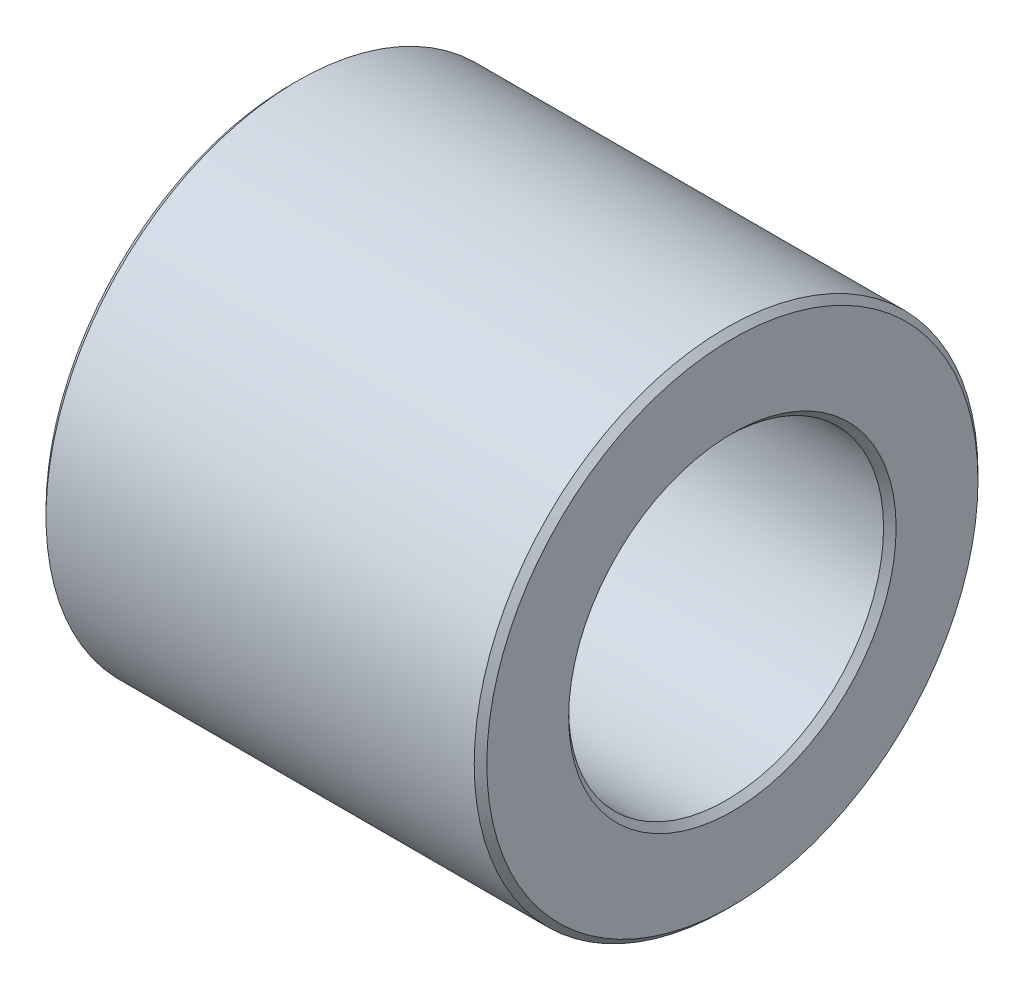
ISO-10303-21;
HEADER;
FILE_DESCRIPTION(('STEP AP214'),'2;1');
FILE_NAME('part.step','',(''),(''),'','','');
FILE_SCHEMA(('AUTOMOTIVE_DESIGN { 1 0 10303 214 1 1 1 1 }'));
ENDSEC;
DATA;
#1=APPLICATION_CONTEXT('core data for automotive mechanical design processes');
#2=APPLICATION_PROTOCOL_DEFINITION('international standard','automotive_design',2000,#1);
#3=PRODUCT_CONTEXT('',#1,'mechanical');
#4=PRODUCT('Part','Part','',(#3));
#5=PRODUCT_RELATED_PRODUCT_CATEGORY('part','',(#4));
#6=PRODUCT_DEFINITION_FORMATION('','',#4);
#7=PRODUCT_DEFINITION_CONTEXT('part definition',#1,'design');
#8=PRODUCT_DEFINITION('design','',#6,#7);
#9=PRODUCT_DEFINITION_SHAPE('','',#8);
#10=(LENGTH_UNIT() NAMED_UNIT(*) SI_UNIT(.MILLI.,.METRE.));
#11=(NAMED_UNIT(*) PLANE_ANGLE_UNIT() SI_UNIT($,.RADIAN.));
#12=(NAMED_UNIT(*) SI_UNIT($,.STERADIAN.) SOLID_ANGLE_UNIT());
#13=UNCERTAINTY_MEASURE_WITH_UNIT(LENGTH_MEASURE(1.E-05),#10,'distance_accuracy_value','');
#14=(GEOMETRIC_REPRESENTATION_CONTEXT(3) GLOBAL_UNCERTAINTY_ASSIGNED_CONTEXT((#13)) GLOBAL_UNIT_ASSIGNED_CONTEXT((#10,
#11,#12)) REPRESENTATION_CONTEXT('',''));
#15=CARTESIAN_POINT('',(0.,0.,0.));
#16=DIRECTION('',(0.,0.,1.));
#17=DIRECTION('',(1.,0.,0.));
#18=AXIS2_PLACEMENT_3D('',#15,#16,#17);
#19=CARTESIAN_POINT('',(7.,0.,0.));
#20=DIRECTION('',(1.,0.,0.));
#21=DIRECTION('',(0.,0.,-1.));
#22=AXIS2_PLACEMENT_3D('',#19,#20,#21);
#23=CYLINDRICAL_SURFACE('',#22,5.);
#24=CARTESIAN_POINT('',(0.200000000006639,0.,0.));
#25=DIRECTION('',(-1.,0.,0.));
#26=DIRECTION('',(0.,1.,0.));
#27=AXIS2_PLACEMENT_3D('',#24,#25,#26);
#28=CIRCLE('',#27,4.99999999993861);
#29=CARTESIAN_POINT('',(0.200000000006639,4.99999999993861,0.));
#30=VERTEX_POINT('',#29);
#31=EDGE_CURVE('E30',#30,#30,#28,.T.);
#32=ORIENTED_EDGE('',*,*,#31,.T.);
#33=EDGE_LOOP('',(#32));
#34=FACE_BOUND('',#33,.T.);
#35=CARTESIAN_POINT('',(13.8000000000034,0.,0.));
#36=DIRECTION('',(1.,0.,0.));
#37=DIRECTION('',(0.,1.,0.));
#38=AXIS2_PLACEMENT_3D('',#35,#36,#37);
#39=CIRCLE('',#38,4.99999999999545);
#40=CARTESIAN_POINT('',(13.8000000000034,4.99999999999545,0.));
#41=VERTEX_POINT('',#40);
#42=EDGE_CURVE('E33',#41,#41,#39,.T.);
#43=ORIENTED_EDGE('',*,*,#42,.T.);
#44=EDGE_LOOP('',(#43));
#45=FACE_BOUND('',#44,.T.);
#46=ADVANCED_FACE('F15',(#34,#45),#23,.F.);
#47=CARTESIAN_POINT('',(13.9999999998963,0.,0.));
#48=DIRECTION('',(1.,0.,0.));
#49=DIRECTION('',(0.,0.,-1.));
#50=AXIS2_PLACEMENT_3D('',#47,#48,#49);
#51=CONICAL_SURFACE('',#50,5.19999999988841,0.78539816325534);
#52=CARTESIAN_POINT('',(13.9999999999532,0.,0.));
#53=DIRECTION('',(1.,0.,0.));
#54=DIRECTION('',(0.,0.,-1.));
#55=AXIS2_PLACEMENT_3D('',#52,#53,#54);
#56=CIRCLE('',#55,5.19999999994525);
#57=CARTESIAN_POINT('',(13.9999999999532,0.,-5.19999999994525));
#58=VERTEX_POINT('',#57);
#59=EDGE_CURVE('E18',#58,#58,#56,.F.);
#60=ORIENTED_EDGE('',*,*,#59,.F.);
#61=EDGE_LOOP('',(#60));
#62=FACE_BOUND('',#61,.T.);
#63=ORIENTED_EDGE('',*,*,#42,.F.);
#64=EDGE_LOOP('',(#63));
#65=FACE_BOUND('',#64,.T.);
#66=ADVANCED_FACE('F49',(#62,#65),#51,.F.);
#67=CARTESIAN_POINT('',(0.,0.,0.));
#68=DIRECTION('',(-1.,0.,0.));
#69=DIRECTION('',(0.,0.,1.));
#70=AXIS2_PLACEMENT_3D('',#67,#68,#69);
#71=CONICAL_SURFACE('',#70,5.20000000000209,0.785398163539557);
#72=CARTESIAN_POINT('',(0.,0.,0.));
#73=DIRECTION('',(-1.,0.,0.));
#74=DIRECTION('',(0.,0.,1.));
#75=AXIS2_PLACEMENT_3D('',#72,#73,#74);
#76=CIRCLE('',#75,5.20000000000209);
#77=CARTESIAN_POINT('',(0.,0.,5.20000000000209));
#78=VERTEX_POINT('',#77);
#79=EDGE_CURVE('E40',#78,#78,#76,.F.);
#80=ORIENTED_EDGE('',*,*,#79,.F.);
#81=EDGE_LOOP('',(#80));
#82=FACE_BOUND('',#81,.T.);
#83=ORIENTED_EDGE('',*,*,#31,.F.);
#84=EDGE_LOOP('',(#83));
#85=FACE_BOUND('',#84,.T.);
#86=ADVANCED_FACE('F52',(#82,#85),#71,.F.);
#87=CARTESIAN_POINT('',(14.,3.9,0.));
#88=DIRECTION('',(1.,0.,0.));
#89=DIRECTION('',(0.,0.,-1.));
#90=AXIS2_PLACEMENT_3D('',#87,#88,#89);
#91=PLANE('',#90);
#92=CARTESIAN_POINT('',(14.,0.,0.));
#93=DIRECTION('',(-1.,0.,0.));
#94=DIRECTION('',(0.,0.,1.));
#95=AXIS2_PLACEMENT_3D('',#92,#93,#94);
#96=CIRCLE('',#95,7.8);
#97=CARTESIAN_POINT('',(14.,0.,7.8));
#98=VERTEX_POINT('',#97);
#99=EDGE_CURVE('E38',#98,#98,#96,.T.);
#100=ORIENTED_EDGE('',*,*,#99,.F.);
#101=EDGE_LOOP('',(#100));
#102=FACE_BOUND('',#101,.T.);
#103=ORIENTED_EDGE('',*,*,#59,.T.);
#104=EDGE_LOOP('',(#103));
#105=FACE_BOUND('',#104,.T.);
#106=ADVANCED_FACE('F47',(#102,#105),#91,.T.);
#107=CARTESIAN_POINT('',(0.,3.9,0.));
#108=DIRECTION('',(-1.,0.,0.));
#109=DIRECTION('',(0.,0.,1.));
#110=AXIS2_PLACEMENT_3D('',#107,#108,#109);
#111=PLANE('',#110);
#112=CARTESIAN_POINT('',(0.,0.,0.));
#113=DIRECTION('',(1.,0.,0.));
#114=DIRECTION('',(0.,0.,-1.));
#115=AXIS2_PLACEMENT_3D('',#112,#113,#114);
#116=CIRCLE('',#115,7.8);
#117=CARTESIAN_POINT('',(0.,0.,-7.8));
#118=VERTEX_POINT('',#117);
#119=EDGE_CURVE('E27',#118,#118,#116,.T.);
#120=ORIENTED_EDGE('',*,*,#119,.F.);
#121=EDGE_LOOP('',(#120));
#122=FACE_BOUND('',#121,.T.);
#123=ORIENTED_EDGE('',*,*,#79,.T.);
#124=EDGE_LOOP('',(#123));
#125=FACE_BOUND('',#124,.T.);
#126=ADVANCED_FACE('F74',(#122,#125),#111,.T.);
#127=CARTESIAN_POINT('',(13.8,0.,0.));
#128=DIRECTION('',(-1.,0.,0.));
#129=DIRECTION('',(0.,0.,1.));
#130=AXIS2_PLACEMENT_3D('',#127,#128,#129);
#131=CONICAL_SURFACE('',#130,8.,0.78539816339745);
#132=ORIENTED_EDGE('',*,*,#99,.T.);
#133=EDGE_LOOP('',(#132));
#134=FACE_BOUND('',#133,.T.);
#135=CARTESIAN_POINT('',(13.8,0.,0.));
#136=DIRECTION('',(1.,0.,0.));
#137=DIRECTION('',(0.,0.,-1.));
#138=AXIS2_PLACEMENT_3D('',#135,#136,#137);
#139=CIRCLE('',#138,8.);
#140=CARTESIAN_POINT('',(13.8,0.,-8.));
#141=VERTEX_POINT('',#140);
#142=EDGE_CURVE('E22',#141,#141,#139,.F.);
#143=ORIENTED_EDGE('',*,*,#142,.F.);
#144=EDGE_LOOP('',(#143));
#145=FACE_BOUND('',#144,.T.);
#146=ADVANCED_FACE('F68',(#134,#145),#131,.T.);
#147=CARTESIAN_POINT('',(0.199999999999999,0.,0.));
#148=DIRECTION('',(1.,0.,0.));
#149=DIRECTION('',(0.,0.,-1.));
#150=AXIS2_PLACEMENT_3D('',#147,#148,#149);
#151=CONICAL_SURFACE('',#150,8.,0.785398163397448);
#152=ORIENTED_EDGE('',*,*,#119,.T.);
#153=EDGE_LOOP('',(#152));
#154=FACE_BOUND('',#153,.T.);
#155=CARTESIAN_POINT('',(0.2,0.,0.));
#156=DIRECTION('',(1.,0.,0.));
#157=DIRECTION('',(0.,0.,-1.));
#158=AXIS2_PLACEMENT_3D('',#155,#156,#157);
#159=CIRCLE('',#158,8.);
#160=CARTESIAN_POINT('',(0.2,0.,-8.));
#161=VERTEX_POINT('',#160);
#162=EDGE_CURVE('E10',#161,#161,#159,.T.);
#163=ORIENTED_EDGE('',*,*,#162,.F.);
#164=EDGE_LOOP('',(#163));
#165=FACE_BOUND('',#164,.T.);
#166=ADVANCED_FACE('F62',(#154,#165),#151,.T.);
#167=CARTESIAN_POINT('',(7.,0.,0.));
#168=DIRECTION('',(1.,0.,0.));
#169=DIRECTION('',(0.,0.,-1.));
#170=AXIS2_PLACEMENT_3D('',#167,#168,#169);
#171=CYLINDRICAL_SURFACE('',#170,8.);
#172=ORIENTED_EDGE('',*,*,#142,.T.);
#173=EDGE_LOOP('',(#172));
#174=FACE_BOUND('',#173,.T.);
#175=ORIENTED_EDGE('',*,*,#162,.T.);
#176=EDGE_LOOP('',(#175));
#177=FACE_BOUND('',#176,.T.);
#178=ADVANCED_FACE('F60',(#174,#177),#171,.T.);
#179=CLOSED_SHELL('',(#46,#66,#86,#106,#126,#146,#166,#178));
#180=MANIFOLD_SOLID_BREP('B1',#179);
#181=ADVANCED_BREP_SHAPE_REPRESENTATION('',(#18,#180),#14);
#182=SHAPE_DEFINITION_REPRESENTATION(#9,#181);
ENDSEC;
END-ISO-10303-21;
